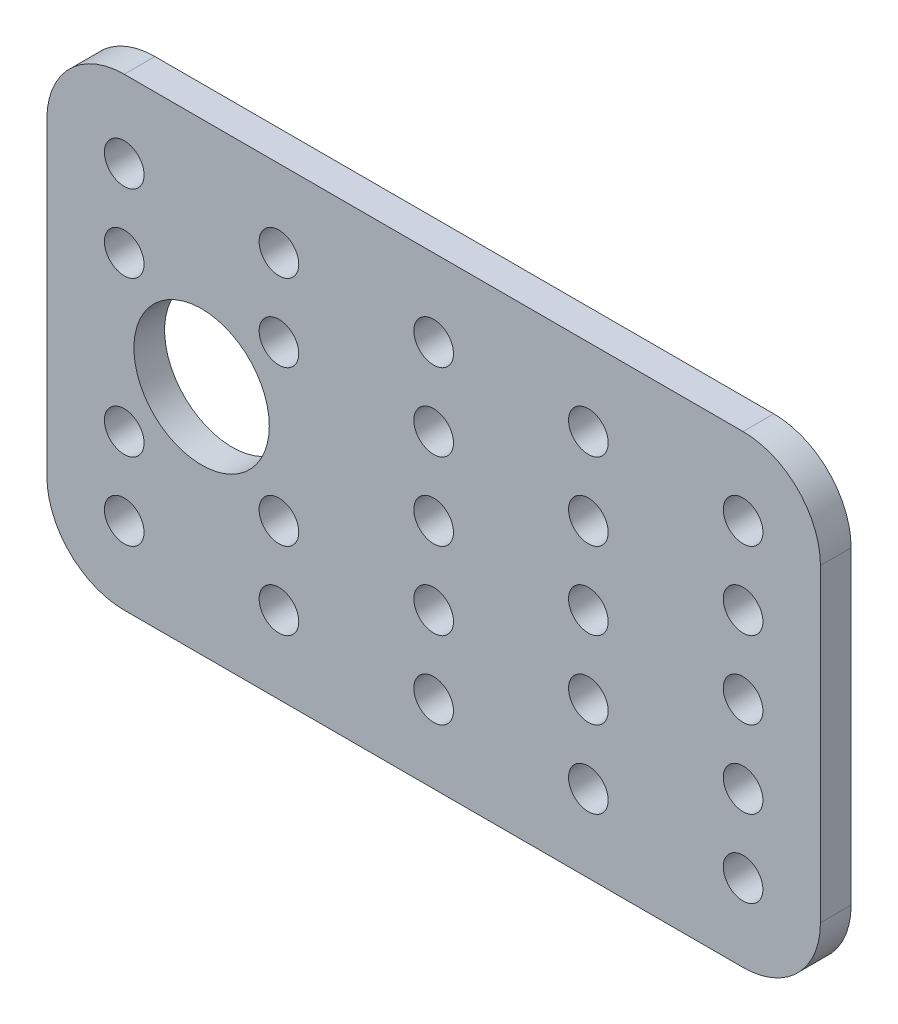
ISO-10303-21;
HEADER;
FILE_DESCRIPTION(('STEP AP214'),'2;1');
FILE_NAME('part.step','',(''),(''),'','','');
FILE_SCHEMA(('AUTOMOTIVE_DESIGN { 1 0 10303 214 1 1 1 1 }'));
ENDSEC;
DATA;
#1=APPLICATION_CONTEXT('core data for automotive mechanical design processes');
#2=APPLICATION_PROTOCOL_DEFINITION('international standard','automotive_design',2000,#1);
#3=PRODUCT_CONTEXT('',#1,'mechanical');
#4=PRODUCT('Part','Part','',(#3));
#5=PRODUCT_RELATED_PRODUCT_CATEGORY('part','',(#4));
#6=PRODUCT_DEFINITION_FORMATION('','',#4);
#7=PRODUCT_DEFINITION_CONTEXT('part definition',#1,'design');
#8=PRODUCT_DEFINITION('design','',#6,#7);
#9=PRODUCT_DEFINITION_SHAPE('','',#8);
#10=(LENGTH_UNIT() NAMED_UNIT(*) SI_UNIT(.MILLI.,.METRE.));
#11=(NAMED_UNIT(*) PLANE_ANGLE_UNIT() SI_UNIT($,.RADIAN.));
#12=(NAMED_UNIT(*) SI_UNIT($,.STERADIAN.) SOLID_ANGLE_UNIT());
#13=UNCERTAINTY_MEASURE_WITH_UNIT(LENGTH_MEASURE(1.E-05),#10,'distance_accuracy_value','');
#14=(GEOMETRIC_REPRESENTATION_CONTEXT(3) GLOBAL_UNCERTAINTY_ASSIGNED_CONTEXT((#13)) GLOBAL_UNIT_ASSIGNED_CONTEXT((#10,
#11,#12)) REPRESENTATION_CONTEXT('',''));
#15=CARTESIAN_POINT('',(0.,0.,0.));
#16=DIRECTION('',(0.,0.,1.));
#17=DIRECTION('',(1.,0.,0.));
#18=AXIS2_PLACEMENT_3D('',#15,#16,#17);
#19=CARTESIAN_POINT('',(0.,0.,3.175));
#20=DIRECTION('',(0.,0.,1.));
#21=DIRECTION('',(1.,0.,0.));
#22=AXIS2_PLACEMENT_3D('',#19,#20,#21);
#23=PLANE('',#22);
#24=CARTESIAN_POINT('',(-31.9999999999998,-8.00000000000001,3.175));
#25=DIRECTION('',(0.,0.,1.));
#26=DIRECTION('',(1.,0.,0.));
#27=AXIS2_PLACEMENT_3D('',#24,#25,#26);
#28=CIRCLE('',#27,2.05);
#29=CARTESIAN_POINT('',(-29.9499999999998,-8.00000000000001,3.175));
#30=VERTEX_POINT('',#29);
#31=EDGE_CURVE('E303',#30,#30,#28,.T.);
#32=ORIENTED_EDGE('',*,*,#31,.F.);
#33=EDGE_LOOP('',(#32));
#34=FACE_BOUND('',#33,.T.);
#35=CARTESIAN_POINT('',(32.0000000000003,-16.,3.175));
#36=DIRECTION('',(0.,0.,1.));
#37=DIRECTION('',(1.,0.,0.));
#38=AXIS2_PLACEMENT_3D('',#35,#36,#37);
#39=CIRCLE('',#38,2.04999999999999);
#40=CARTESIAN_POINT('',(34.0500000000003,-16.,3.175));
#41=VERTEX_POINT('',#40);
#42=EDGE_CURVE('E291',#41,#41,#39,.T.);
#43=ORIENTED_EDGE('',*,*,#42,.F.);
#44=EDGE_LOOP('',(#43));
#45=FACE_BOUND('',#44,.T.);
#46=CARTESIAN_POINT('',(3.33066907387547E-13,-16.,3.175));
#47=DIRECTION('',(0.,0.,1.));
#48=DIRECTION('',(1.,0.,0.));
#49=AXIS2_PLACEMENT_3D('',#46,#47,#48);
#50=CIRCLE('',#49,2.04999999999999);
#51=CARTESIAN_POINT('',(2.05000000000033,-16.,3.175));
#52=VERTEX_POINT('',#51);
#53=EDGE_CURVE('E279',#52,#52,#50,.T.);
#54=ORIENTED_EDGE('',*,*,#53,.F.);
#55=EDGE_LOOP('',(#54));
#56=FACE_BOUND('',#55,.T.);
#57=CARTESIAN_POINT('',(32.0000000000002,-8.00000000000001,3.175));
#58=DIRECTION('',(0.,0.,1.));
#59=DIRECTION('',(1.,0.,0.));
#60=AXIS2_PLACEMENT_3D('',#57,#58,#59);
#61=CIRCLE('',#60,2.04999999999999);
#62=CARTESIAN_POINT('',(34.0500000000002,-8.00000000000001,3.175));
#63=VERTEX_POINT('',#62);
#64=EDGE_CURVE('E267',#63,#63,#61,.T.);
#65=ORIENTED_EDGE('',*,*,#64,.F.);
#66=EDGE_LOOP('',(#65));
#67=FACE_BOUND('',#66,.T.);
#68=CARTESIAN_POINT('',(2.4980018054066E-13,-8.00000000000001,3.175));
#69=DIRECTION('',(0.,0.,1.));
#70=DIRECTION('',(1.,0.,0.));
#71=AXIS2_PLACEMENT_3D('',#68,#69,#70);
#72=CIRCLE('',#71,2.04999999999999);
#73=CARTESIAN_POINT('',(2.05000000000024,-8.00000000000001,3.175));
#74=VERTEX_POINT('',#73);
#75=EDGE_CURVE('E255',#74,#74,#72,.T.);
#76=ORIENTED_EDGE('',*,*,#75,.F.);
#77=EDGE_LOOP('',(#76));
#78=FACE_BOUND('',#77,.T.);
#79=CARTESIAN_POINT('',(32.0000000000002,0.,3.175));
#80=DIRECTION('',(0.,0.,1.));
#81=DIRECTION('',(1.,0.,0.));
#82=AXIS2_PLACEMENT_3D('',#79,#80,#81);
#83=CIRCLE('',#82,2.04999999999999);
#84=CARTESIAN_POINT('',(34.0500000000002,0.,3.175));
#85=VERTEX_POINT('',#84);
#86=EDGE_CURVE('E243',#85,#85,#83,.T.);
#87=ORIENTED_EDGE('',*,*,#86,.F.);
#88=EDGE_LOOP('',(#87));
#89=FACE_BOUND('',#88,.T.);
#90=CARTESIAN_POINT('',(1.66533453693773E-13,0.,3.175));
#91=DIRECTION('',(0.,0.,1.));
#92=DIRECTION('',(1.,0.,0.));
#93=AXIS2_PLACEMENT_3D('',#90,#91,#92);
#94=CIRCLE('',#93,2.04999999999999);
#95=CARTESIAN_POINT('',(2.05000000000016,0.,3.175));
#96=VERTEX_POINT('',#95);
#97=EDGE_CURVE('E231',#96,#96,#94,.T.);
#98=ORIENTED_EDGE('',*,*,#97,.F.);
#99=EDGE_LOOP('',(#98));
#100=FACE_BOUND('',#99,.T.);
#101=CARTESIAN_POINT('',(16.0000000000001,7.99999999999999,3.175));
#102=DIRECTION('',(0.,0.,1.));
#103=DIRECTION('',(1.,0.,0.));
#104=AXIS2_PLACEMENT_3D('',#101,#102,#103);
#105=CIRCLE('',#104,2.04999999999999);
#106=CARTESIAN_POINT('',(18.0500000000001,7.99999999999999,3.175));
#107=VERTEX_POINT('',#106);
#108=EDGE_CURVE('E219',#107,#107,#105,.T.);
#109=ORIENTED_EDGE('',*,*,#108,.F.);
#110=EDGE_LOOP('',(#109));
#111=FACE_BOUND('',#110,.T.);
#112=CARTESIAN_POINT('',(-15.9999999999999,7.99999999999999,3.175));
#113=DIRECTION('',(0.,0.,1.));
#114=DIRECTION('',(1.,0.,0.));
#115=AXIS2_PLACEMENT_3D('',#112,#113,#114);
#116=CIRCLE('',#115,2.05);
#117=CARTESIAN_POINT('',(-13.9499999999999,7.99999999999999,3.175));
#118=VERTEX_POINT('',#117);
#119=EDGE_CURVE('E207',#118,#118,#116,.T.);
#120=ORIENTED_EDGE('',*,*,#119,.F.);
#121=EDGE_LOOP('',(#120));
#122=FACE_BOUND('',#121,.T.);
#123=CARTESIAN_POINT('',(16.,16.,3.175));
#124=DIRECTION('',(0.,0.,1.));
#125=DIRECTION('',(1.,0.,0.));
#126=AXIS2_PLACEMENT_3D('',#123,#124,#125);
#127=CIRCLE('',#126,2.05);
#128=CARTESIAN_POINT('',(18.05,16.,3.175));
#129=VERTEX_POINT('',#128);
#130=EDGE_CURVE('E195',#129,#129,#127,.T.);
#131=ORIENTED_EDGE('',*,*,#130,.F.);
#132=EDGE_LOOP('',(#131));
#133=FACE_BOUND('',#132,.T.);
#134=CARTESIAN_POINT('',(-16.,16.,3.175));
#135=DIRECTION('',(0.,0.,1.));
#136=DIRECTION('',(1.,0.,0.));
#137=AXIS2_PLACEMENT_3D('',#134,#135,#136);
#138=CIRCLE('',#137,2.05);
#139=CARTESIAN_POINT('',(-13.95,16.,3.175));
#140=VERTEX_POINT('',#139);
#141=EDGE_CURVE('E183',#140,#140,#138,.T.);
#142=ORIENTED_EDGE('',*,*,#141,.F.);
#143=EDGE_LOOP('',(#142));
#144=FACE_BOUND('',#143,.T.);
#145=CARTESIAN_POINT('',(-24.,0.,3.175));
#146=DIRECTION('',(0.,0.,1.));
#147=DIRECTION('',(1.,0.,0.));
#148=AXIS2_PLACEMENT_3D('',#145,#146,#147);
#149=CIRCLE('',#148,7.);
#150=CARTESIAN_POINT('',(-17.,0.,3.175));
#151=VERTEX_POINT('',#150);
#152=EDGE_CURVE('E166',#151,#151,#149,.T.);
#153=ORIENTED_EDGE('',*,*,#152,.F.);
#154=EDGE_LOOP('',(#153));
#155=FACE_BOUND('',#154,.T.);
#156=DIRECTION('',(0.,1.,0.));
#157=VECTOR('',#156,1.);
#158=CARTESIAN_POINT('',(40.,-24.,3.175));
#159=LINE('',#158,#157);
#160=CARTESIAN_POINT('',(40.,-16.,3.175));
#161=VERTEX_POINT('',#160);
#162=CARTESIAN_POINT('',(40.,16.,3.175));
#163=VERTEX_POINT('',#162);
#164=EDGE_CURVE('E173',#161,#163,#159,.T.);
#165=ORIENTED_EDGE('',*,*,#164,.T.);
#166=CARTESIAN_POINT('',(32.,16.,3.175));
#167=DIRECTION('',(0.,0.,1.));
#168=DIRECTION('',(1.,0.,0.));
#169=AXIS2_PLACEMENT_3D('',#166,#167,#168);
#170=CIRCLE('',#169,8.);
#171=CARTESIAN_POINT('',(32.,24.,3.175));
#172=VERTEX_POINT('',#171);
#173=EDGE_CURVE('E150',#163,#172,#170,.T.);
#174=ORIENTED_EDGE('',*,*,#173,.T.);
#175=DIRECTION('',(-1.,0.,0.));
#176=VECTOR('',#175,1.);
#177=CARTESIAN_POINT('',(40.,24.,3.175));
#178=LINE('',#177,#176);
#179=CARTESIAN_POINT('',(-32.,24.,3.175));
#180=VERTEX_POINT('',#179);
#181=EDGE_CURVE('E121',#172,#180,#178,.T.);
#182=ORIENTED_EDGE('',*,*,#181,.T.);
#183=CARTESIAN_POINT('',(-32.,16.,3.175));
#184=DIRECTION('',(0.,0.,1.));
#185=DIRECTION('',(1.,0.,0.));
#186=AXIS2_PLACEMENT_3D('',#183,#184,#185);
#187=CIRCLE('',#186,8.);
#188=CARTESIAN_POINT('',(-40.,16.,3.175));
#189=VERTEX_POINT('',#188);
#190=EDGE_CURVE('E145',#180,#189,#187,.T.);
#191=ORIENTED_EDGE('',*,*,#190,.T.);
#192=DIRECTION('',(0.,-1.,0.));
#193=VECTOR('',#192,1.);
#194=CARTESIAN_POINT('',(-40.,-24.,3.175));
#195=LINE('',#194,#193);
#196=CARTESIAN_POINT('',(-40.,-16.,3.175));
#197=VERTEX_POINT('',#196);
#198=EDGE_CURVE('E128',#189,#197,#195,.T.);
#199=ORIENTED_EDGE('',*,*,#198,.T.);
#200=CARTESIAN_POINT('',(-32.,-16.,3.175));
#201=DIRECTION('',(0.,0.,1.));
#202=DIRECTION('',(1.,0.,0.));
#203=AXIS2_PLACEMENT_3D('',#200,#201,#202);
#204=CIRCLE('',#203,8.);
#205=CARTESIAN_POINT('',(-32.,-24.,3.175));
#206=VERTEX_POINT('',#205);
#207=EDGE_CURVE('E57',#197,#206,#204,.T.);
#208=ORIENTED_EDGE('',*,*,#207,.T.);
#209=DIRECTION('',(1.,0.,0.));
#210=VECTOR('',#209,1.);
#211=CARTESIAN_POINT('',(40.,-24.,3.175));
#212=LINE('',#211,#210);
#213=CARTESIAN_POINT('',(32.,-24.,3.175));
#214=VERTEX_POINT('',#213);
#215=EDGE_CURVE('E131',#206,#214,#212,.T.);
#216=ORIENTED_EDGE('',*,*,#215,.T.);
#217=CARTESIAN_POINT('',(32.,-16.,3.175));
#218=DIRECTION('',(0.,0.,1.));
#219=DIRECTION('',(1.,0.,0.));
#220=AXIS2_PLACEMENT_3D('',#217,#218,#219);
#221=CIRCLE('',#220,8.);
#222=EDGE_CURVE('E148',#214,#161,#221,.T.);
#223=ORIENTED_EDGE('',*,*,#222,.T.);
#224=EDGE_LOOP('',(#165,#174,#182,#191,#199,#208,#216,#223));
#225=FACE_BOUND('',#224,.T.);
#226=CARTESIAN_POINT('',(-32.,16.,3.175));
#227=DIRECTION('',(0.,0.,1.));
#228=DIRECTION('',(1.,0.,0.));
#229=AXIS2_PLACEMENT_3D('',#226,#227,#228);
#230=CIRCLE('',#229,2.05);
#231=CARTESIAN_POINT('',(-29.95,16.,3.175));
#232=VERTEX_POINT('',#231);
#233=EDGE_CURVE('E178',#232,#232,#230,.T.);
#234=ORIENTED_EDGE('',*,*,#233,.F.);
#235=EDGE_LOOP('',(#234));
#236=FACE_BOUND('',#235,.T.);
#237=CARTESIAN_POINT('',(0.,16.,3.175));
#238=DIRECTION('',(0.,0.,1.));
#239=DIRECTION('',(1.,0.,0.));
#240=AXIS2_PLACEMENT_3D('',#237,#238,#239);
#241=CIRCLE('',#240,2.04999999999999);
#242=CARTESIAN_POINT('',(2.04999999999999,16.,3.175));
#243=VERTEX_POINT('',#242);
#244=EDGE_CURVE('E189',#243,#243,#241,.T.);
#245=ORIENTED_EDGE('',*,*,#244,.F.);
#246=EDGE_LOOP('',(#245));
#247=FACE_BOUND('',#246,.T.);
#248=CARTESIAN_POINT('',(32.,16.,3.175));
#249=DIRECTION('',(0.,0.,1.));
#250=DIRECTION('',(1.,0.,0.));
#251=AXIS2_PLACEMENT_3D('',#248,#249,#250);
#252=CIRCLE('',#251,2.04999999999999);
#253=CARTESIAN_POINT('',(34.05,16.,3.175));
#254=VERTEX_POINT('',#253);
#255=EDGE_CURVE('E201',#254,#254,#252,.T.);
#256=ORIENTED_EDGE('',*,*,#255,.F.);
#257=EDGE_LOOP('',(#256));
#258=FACE_BOUND('',#257,.T.);
#259=CARTESIAN_POINT('',(0.,7.99999999999999,3.175));
#260=DIRECTION('',(0.,0.,1.));
#261=DIRECTION('',(1.,0.,0.));
#262=AXIS2_PLACEMENT_3D('',#259,#260,#261);
#263=CIRCLE('',#262,2.04999999999999);
#264=CARTESIAN_POINT('',(2.05000000000008,7.99999999999999,3.175));
#265=VERTEX_POINT('',#264);
#266=EDGE_CURVE('E213',#265,#265,#263,.T.);
#267=ORIENTED_EDGE('',*,*,#266,.F.);
#268=EDGE_LOOP('',(#267));
#269=FACE_BOUND('',#268,.T.);
#270=CARTESIAN_POINT('',(32.0000000000001,7.99999999999999,3.175));
#271=DIRECTION('',(0.,0.,1.));
#272=DIRECTION('',(1.,0.,0.));
#273=AXIS2_PLACEMENT_3D('',#270,#271,#272);
#274=CIRCLE('',#273,2.04999999999999);
#275=CARTESIAN_POINT('',(34.0500000000001,7.99999999999999,3.175));
#276=VERTEX_POINT('',#275);
#277=EDGE_CURVE('E225',#276,#276,#274,.T.);
#278=ORIENTED_EDGE('',*,*,#277,.F.);
#279=EDGE_LOOP('',(#278));
#280=FACE_BOUND('',#279,.T.);
#281=CARTESIAN_POINT('',(16.0000000000002,0.,3.175));
#282=DIRECTION('',(0.,0.,1.));
#283=DIRECTION('',(1.,0.,0.));
#284=AXIS2_PLACEMENT_3D('',#281,#282,#283);
#285=CIRCLE('',#284,2.04999999999999);
#286=CARTESIAN_POINT('',(18.0500000000002,0.,3.175));
#287=VERTEX_POINT('',#286);
#288=EDGE_CURVE('E237',#287,#287,#285,.T.);
#289=ORIENTED_EDGE('',*,*,#288,.F.);
#290=EDGE_LOOP('',(#289));
#291=FACE_BOUND('',#290,.T.);
#292=CARTESIAN_POINT('',(-15.9999999999998,-8.00000000000001,3.175));
#293=DIRECTION('',(0.,0.,1.));
#294=DIRECTION('',(1.,0.,0.));
#295=AXIS2_PLACEMENT_3D('',#292,#293,#294);
#296=CIRCLE('',#295,2.04999999999999);
#297=CARTESIAN_POINT('',(-13.9499999999998,-8.00000000000001,3.175));
#298=VERTEX_POINT('',#297);
#299=EDGE_CURVE('E249',#298,#298,#296,.T.);
#300=ORIENTED_EDGE('',*,*,#299,.F.);
#301=EDGE_LOOP('',(#300));
#302=FACE_BOUND('',#301,.T.);
#303=CARTESIAN_POINT('',(16.0000000000002,-8.00000000000001,3.175));
#304=DIRECTION('',(0.,0.,1.));
#305=DIRECTION('',(1.,0.,0.));
#306=AXIS2_PLACEMENT_3D('',#303,#304,#305);
#307=CIRCLE('',#306,2.04999999999999);
#308=CARTESIAN_POINT('',(18.0500000000002,-8.00000000000001,3.175));
#309=VERTEX_POINT('',#308);
#310=EDGE_CURVE('E261',#309,#309,#307,.T.);
#311=ORIENTED_EDGE('',*,*,#310,.F.);
#312=EDGE_LOOP('',(#311));
#313=FACE_BOUND('',#312,.T.);
#314=CARTESIAN_POINT('',(-15.9999999999997,-16.,3.175));
#315=DIRECTION('',(0.,0.,1.));
#316=DIRECTION('',(1.,0.,0.));
#317=AXIS2_PLACEMENT_3D('',#314,#315,#316);
#318=CIRCLE('',#317,2.05);
#319=CARTESIAN_POINT('',(-13.9499999999997,-16.,3.175));
#320=VERTEX_POINT('',#319);
#321=EDGE_CURVE('E273',#320,#320,#318,.T.);
#322=ORIENTED_EDGE('',*,*,#321,.F.);
#323=EDGE_LOOP('',(#322));
#324=FACE_BOUND('',#323,.T.);
#325=CARTESIAN_POINT('',(16.0000000000003,-16.,3.175));
#326=DIRECTION('',(0.,0.,1.));
#327=DIRECTION('',(1.,0.,0.));
#328=AXIS2_PLACEMENT_3D('',#325,#326,#327);
#329=CIRCLE('',#328,2.04999999999999);
#330=CARTESIAN_POINT('',(18.0500000000003,-16.,3.175));
#331=VERTEX_POINT('',#330);
#332=EDGE_CURVE('E285',#331,#331,#329,.T.);
#333=ORIENTED_EDGE('',*,*,#332,.F.);
#334=EDGE_LOOP('',(#333));
#335=FACE_BOUND('',#334,.T.);
#336=CARTESIAN_POINT('',(-31.9999999999999,7.99999999999999,3.175));
#337=DIRECTION('',(0.,0.,1.));
#338=DIRECTION('',(1.,0.,0.));
#339=AXIS2_PLACEMENT_3D('',#336,#337,#338);
#340=CIRCLE('',#339,2.05);
#341=CARTESIAN_POINT('',(-29.9499999999999,7.99999999999999,3.175));
#342=VERTEX_POINT('',#341);
#343=EDGE_CURVE('E297',#342,#342,#340,.T.);
#344=ORIENTED_EDGE('',*,*,#343,.F.);
#345=EDGE_LOOP('',(#344));
#346=FACE_BOUND('',#345,.T.);
#347=CARTESIAN_POINT('',(-31.9999999999997,-16.,3.175));
#348=DIRECTION('',(0.,0.,1.));
#349=DIRECTION('',(1.,0.,0.));
#350=AXIS2_PLACEMENT_3D('',#347,#348,#349);
#351=CIRCLE('',#350,2.05);
#352=CARTESIAN_POINT('',(-29.9499999999997,-16.,3.175));
#353=VERTEX_POINT('',#352);
#354=EDGE_CURVE('E309',#353,#353,#351,.T.);
#355=ORIENTED_EDGE('',*,*,#354,.F.);
#356=EDGE_LOOP('',(#355));
#357=FACE_BOUND('',#356,.T.);
#358=ADVANCED_FACE('F35',(#34,#45,#56,#67,#78,#89,#100,#111,#122,#133,#144,#155,#225,#236,#247,
#258,#269,#280,#291,#302,#313,#324,#335,#346,#357),#23,.T.);
#359=CARTESIAN_POINT('',(0.,0.,0.));
#360=DIRECTION('',(0.,0.,1.));
#361=DIRECTION('',(1.,0.,0.));
#362=AXIS2_PLACEMENT_3D('',#359,#360,#361);
#363=PLANE('',#362);
#364=DIRECTION('',(-1.,0.,0.));
#365=VECTOR('',#364,1.);
#366=CARTESIAN_POINT('',(40.,24.,0.));
#367=LINE('',#366,#365);
#368=CARTESIAN_POINT('',(32.,24.,0.));
#369=VERTEX_POINT('',#368);
#370=CARTESIAN_POINT('',(-32.,24.,0.));
#371=VERTEX_POINT('',#370);
#372=EDGE_CURVE('E118',#369,#371,#367,.T.);
#373=ORIENTED_EDGE('',*,*,#372,.F.);
#374=CARTESIAN_POINT('',(32.,16.,0.));
#375=DIRECTION('',(0.,0.,1.));
#376=DIRECTION('',(1.,0.,0.));
#377=AXIS2_PLACEMENT_3D('',#374,#375,#376);
#378=CIRCLE('',#377,8.);
#379=CARTESIAN_POINT('',(40.,16.,0.));
#380=VERTEX_POINT('',#379);
#381=EDGE_CURVE('E101',#369,#380,#378,.F.);
#382=ORIENTED_EDGE('',*,*,#381,.T.);
#383=DIRECTION('',(0.,1.,0.));
#384=VECTOR('',#383,1.);
#385=CARTESIAN_POINT('',(40.,-24.,0.));
#386=LINE('',#385,#384);
#387=CARTESIAN_POINT('',(40.,-16.,0.));
#388=VERTEX_POINT('',#387);
#389=EDGE_CURVE('E129',#388,#380,#386,.T.);
#390=ORIENTED_EDGE('',*,*,#389,.F.);
#391=CARTESIAN_POINT('',(32.,-16.,0.));
#392=DIRECTION('',(0.,0.,1.));
#393=DIRECTION('',(1.,0.,0.));
#394=AXIS2_PLACEMENT_3D('',#391,#392,#393);
#395=CIRCLE('',#394,8.);
#396=CARTESIAN_POINT('',(32.,-24.,0.));
#397=VERTEX_POINT('',#396);
#398=EDGE_CURVE('E112',#388,#397,#395,.F.);
#399=ORIENTED_EDGE('',*,*,#398,.T.);
#400=DIRECTION('',(1.,0.,0.));
#401=VECTOR('',#400,1.);
#402=CARTESIAN_POINT('',(40.,-24.,0.));
#403=LINE('',#402,#401);
#404=CARTESIAN_POINT('',(-32.,-24.,0.));
#405=VERTEX_POINT('',#404);
#406=EDGE_CURVE('E133',#405,#397,#403,.T.);
#407=ORIENTED_EDGE('',*,*,#406,.F.);
#408=CARTESIAN_POINT('',(-32.,-16.,0.));
#409=DIRECTION('',(0.,0.,1.));
#410=DIRECTION('',(1.,0.,0.));
#411=AXIS2_PLACEMENT_3D('',#408,#409,#410);
#412=CIRCLE('',#411,8.);
#413=CARTESIAN_POINT('',(-40.,-16.,0.));
#414=VERTEX_POINT('',#413);
#415=EDGE_CURVE('E139',#405,#414,#412,.F.);
#416=ORIENTED_EDGE('',*,*,#415,.T.);
#417=DIRECTION('',(0.,-1.,0.));
#418=VECTOR('',#417,1.);
#419=CARTESIAN_POINT('',(-40.,-24.,0.));
#420=LINE('',#419,#418);
#421=CARTESIAN_POINT('',(-40.,16.,0.));
#422=VERTEX_POINT('',#421);
#423=EDGE_CURVE('E161',#422,#414,#420,.T.);
#424=ORIENTED_EDGE('',*,*,#423,.F.);
#425=CARTESIAN_POINT('',(-32.,16.,0.));
#426=DIRECTION('',(0.,0.,1.));
#427=DIRECTION('',(1.,0.,0.));
#428=AXIS2_PLACEMENT_3D('',#425,#426,#427);
#429=CIRCLE('',#428,8.);
#430=EDGE_CURVE('E122',#422,#371,#429,.F.);
#431=ORIENTED_EDGE('',*,*,#430,.T.);
#432=EDGE_LOOP('',(#373,#382,#390,#399,#407,#416,#424,#431));
#433=FACE_BOUND('',#432,.T.);
#434=CARTESIAN_POINT('',(-24.,0.,0.));
#435=DIRECTION('',(0.,0.,1.));
#436=DIRECTION('',(1.,0.,0.));
#437=AXIS2_PLACEMENT_3D('',#434,#435,#436);
#438=CIRCLE('',#437,7.);
#439=CARTESIAN_POINT('',(-17.,0.,0.));
#440=VERTEX_POINT('',#439);
#441=EDGE_CURVE('E169',#440,#440,#438,.T.);
#442=ORIENTED_EDGE('',*,*,#441,.T.);
#443=EDGE_LOOP('',(#442));
#444=FACE_BOUND('',#443,.T.);
#445=CARTESIAN_POINT('',(-32.,16.,0.));
#446=DIRECTION('',(0.,0.,1.));
#447=DIRECTION('',(1.,0.,0.));
#448=AXIS2_PLACEMENT_3D('',#445,#446,#447);
#449=CIRCLE('',#448,2.05);
#450=CARTESIAN_POINT('',(-29.95,16.,0.));
#451=VERTEX_POINT('',#450);
#452=EDGE_CURVE('E180',#451,#451,#449,.T.);
#453=ORIENTED_EDGE('',*,*,#452,.T.);
#454=EDGE_LOOP('',(#453));
#455=FACE_BOUND('',#454,.T.);
#456=CARTESIAN_POINT('',(-16.,16.,0.));
#457=DIRECTION('',(0.,0.,1.));
#458=DIRECTION('',(1.,0.,0.));
#459=AXIS2_PLACEMENT_3D('',#456,#457,#458);
#460=CIRCLE('',#459,2.05);
#461=CARTESIAN_POINT('',(-13.95,16.,0.));
#462=VERTEX_POINT('',#461);
#463=EDGE_CURVE('E186',#462,#462,#460,.T.);
#464=ORIENTED_EDGE('',*,*,#463,.T.);
#465=EDGE_LOOP('',(#464));
#466=FACE_BOUND('',#465,.T.);
#467=CARTESIAN_POINT('',(0.,16.,0.));
#468=DIRECTION('',(0.,0.,1.));
#469=DIRECTION('',(1.,0.,0.));
#470=AXIS2_PLACEMENT_3D('',#467,#468,#469);
#471=CIRCLE('',#470,2.04999999999999);
#472=CARTESIAN_POINT('',(2.04999999999999,16.,0.));
#473=VERTEX_POINT('',#472);
#474=EDGE_CURVE('E192',#473,#473,#471,.T.);
#475=ORIENTED_EDGE('',*,*,#474,.T.);
#476=EDGE_LOOP('',(#475));
#477=FACE_BOUND('',#476,.T.);
#478=CARTESIAN_POINT('',(16.,16.,0.));
#479=DIRECTION('',(0.,0.,1.));
#480=DIRECTION('',(1.,0.,0.));
#481=AXIS2_PLACEMENT_3D('',#478,#479,#480);
#482=CIRCLE('',#481,2.05);
#483=CARTESIAN_POINT('',(18.05,16.,0.));
#484=VERTEX_POINT('',#483);
#485=EDGE_CURVE('E198',#484,#484,#482,.T.);
#486=ORIENTED_EDGE('',*,*,#485,.T.);
#487=EDGE_LOOP('',(#486));
#488=FACE_BOUND('',#487,.T.);
#489=CARTESIAN_POINT('',(32.,16.,0.));
#490=DIRECTION('',(0.,0.,1.));
#491=DIRECTION('',(1.,0.,0.));
#492=AXIS2_PLACEMENT_3D('',#489,#490,#491);
#493=CIRCLE('',#492,2.04999999999999);
#494=CARTESIAN_POINT('',(34.05,16.,0.));
#495=VERTEX_POINT('',#494);
#496=EDGE_CURVE('E204',#495,#495,#493,.T.);
#497=ORIENTED_EDGE('',*,*,#496,.T.);
#498=EDGE_LOOP('',(#497));
#499=FACE_BOUND('',#498,.T.);
#500=CARTESIAN_POINT('',(-15.9999999999999,7.99999999999999,0.));
#501=DIRECTION('',(0.,0.,1.));
#502=DIRECTION('',(1.,0.,0.));
#503=AXIS2_PLACEMENT_3D('',#500,#501,#502);
#504=CIRCLE('',#503,2.05);
#505=CARTESIAN_POINT('',(-13.9499999999999,7.99999999999999,0.));
#506=VERTEX_POINT('',#505);
#507=EDGE_CURVE('E210',#506,#506,#504,.T.);
#508=ORIENTED_EDGE('',*,*,#507,.T.);
#509=EDGE_LOOP('',(#508));
#510=FACE_BOUND('',#509,.T.);
#511=CARTESIAN_POINT('',(0.,7.99999999999999,0.));
#512=DIRECTION('',(0.,0.,1.));
#513=DIRECTION('',(1.,0.,0.));
#514=AXIS2_PLACEMENT_3D('',#511,#512,#513);
#515=CIRCLE('',#514,2.04999999999999);
#516=CARTESIAN_POINT('',(2.05000000000008,7.99999999999999,0.));
#517=VERTEX_POINT('',#516);
#518=EDGE_CURVE('E216',#517,#517,#515,.T.);
#519=ORIENTED_EDGE('',*,*,#518,.T.);
#520=EDGE_LOOP('',(#519));
#521=FACE_BOUND('',#520,.T.);
#522=CARTESIAN_POINT('',(16.0000000000001,7.99999999999999,0.));
#523=DIRECTION('',(0.,0.,1.));
#524=DIRECTION('',(1.,0.,0.));
#525=AXIS2_PLACEMENT_3D('',#522,#523,#524);
#526=CIRCLE('',#525,2.04999999999999);
#527=CARTESIAN_POINT('',(18.0500000000001,7.99999999999999,0.));
#528=VERTEX_POINT('',#527);
#529=EDGE_CURVE('E222',#528,#528,#526,.T.);
#530=ORIENTED_EDGE('',*,*,#529,.T.);
#531=EDGE_LOOP('',(#530));
#532=FACE_BOUND('',#531,.T.);
#533=CARTESIAN_POINT('',(32.0000000000001,7.99999999999999,0.));
#534=DIRECTION('',(0.,0.,1.));
#535=DIRECTION('',(1.,0.,0.));
#536=AXIS2_PLACEMENT_3D('',#533,#534,#535);
#537=CIRCLE('',#536,2.04999999999999);
#538=CARTESIAN_POINT('',(34.0500000000001,7.99999999999999,0.));
#539=VERTEX_POINT('',#538);
#540=EDGE_CURVE('E228',#539,#539,#537,.T.);
#541=ORIENTED_EDGE('',*,*,#540,.T.);
#542=EDGE_LOOP('',(#541));
#543=FACE_BOUND('',#542,.T.);
#544=CARTESIAN_POINT('',(1.66533453693773E-13,0.,0.));
#545=DIRECTION('',(0.,0.,1.));
#546=DIRECTION('',(1.,0.,0.));
#547=AXIS2_PLACEMENT_3D('',#544,#545,#546);
#548=CIRCLE('',#547,2.04999999999999);
#549=CARTESIAN_POINT('',(2.05000000000016,0.,0.));
#550=VERTEX_POINT('',#549);
#551=EDGE_CURVE('E234',#550,#550,#548,.T.);
#552=ORIENTED_EDGE('',*,*,#551,.T.);
#553=EDGE_LOOP('',(#552));
#554=FACE_BOUND('',#553,.T.);
#555=CARTESIAN_POINT('',(16.0000000000002,0.,0.));
#556=DIRECTION('',(0.,0.,1.));
#557=DIRECTION('',(1.,0.,0.));
#558=AXIS2_PLACEMENT_3D('',#555,#556,#557);
#559=CIRCLE('',#558,2.04999999999999);
#560=CARTESIAN_POINT('',(18.0500000000002,0.,0.));
#561=VERTEX_POINT('',#560);
#562=EDGE_CURVE('E240',#561,#561,#559,.T.);
#563=ORIENTED_EDGE('',*,*,#562,.T.);
#564=EDGE_LOOP('',(#563));
#565=FACE_BOUND('',#564,.T.);
#566=CARTESIAN_POINT('',(32.0000000000002,0.,0.));
#567=DIRECTION('',(0.,0.,1.));
#568=DIRECTION('',(1.,0.,0.));
#569=AXIS2_PLACEMENT_3D('',#566,#567,#568);
#570=CIRCLE('',#569,2.04999999999999);
#571=CARTESIAN_POINT('',(34.0500000000002,0.,0.));
#572=VERTEX_POINT('',#571);
#573=EDGE_CURVE('E246',#572,#572,#570,.T.);
#574=ORIENTED_EDGE('',*,*,#573,.T.);
#575=EDGE_LOOP('',(#574));
#576=FACE_BOUND('',#575,.T.);
#577=CARTESIAN_POINT('',(-15.9999999999998,-8.00000000000001,0.));
#578=DIRECTION('',(0.,0.,1.));
#579=DIRECTION('',(1.,0.,0.));
#580=AXIS2_PLACEMENT_3D('',#577,#578,#579);
#581=CIRCLE('',#580,2.04999999999999);
#582=CARTESIAN_POINT('',(-13.9499999999998,-8.00000000000001,0.));
#583=VERTEX_POINT('',#582);
#584=EDGE_CURVE('E252',#583,#583,#581,.T.);
#585=ORIENTED_EDGE('',*,*,#584,.T.);
#586=EDGE_LOOP('',(#585));
#587=FACE_BOUND('',#586,.T.);
#588=CARTESIAN_POINT('',(2.4980018054066E-13,-8.00000000000001,0.));
#589=DIRECTION('',(0.,0.,1.));
#590=DIRECTION('',(1.,0.,0.));
#591=AXIS2_PLACEMENT_3D('',#588,#589,#590);
#592=CIRCLE('',#591,2.04999999999999);
#593=CARTESIAN_POINT('',(2.05000000000024,-8.00000000000001,0.));
#594=VERTEX_POINT('',#593);
#595=EDGE_CURVE('E258',#594,#594,#592,.T.);
#596=ORIENTED_EDGE('',*,*,#595,.T.);
#597=EDGE_LOOP('',(#596));
#598=FACE_BOUND('',#597,.T.);
#599=CARTESIAN_POINT('',(16.0000000000002,-8.00000000000001,0.));
#600=DIRECTION('',(0.,0.,1.));
#601=DIRECTION('',(1.,0.,0.));
#602=AXIS2_PLACEMENT_3D('',#599,#600,#601);
#603=CIRCLE('',#602,2.04999999999999);
#604=CARTESIAN_POINT('',(18.0500000000002,-8.00000000000001,0.));
#605=VERTEX_POINT('',#604);
#606=EDGE_CURVE('E264',#605,#605,#603,.T.);
#607=ORIENTED_EDGE('',*,*,#606,.T.);
#608=EDGE_LOOP('',(#607));
#609=FACE_BOUND('',#608,.T.);
#610=CARTESIAN_POINT('',(32.0000000000002,-8.00000000000001,0.));
#611=DIRECTION('',(0.,0.,1.));
#612=DIRECTION('',(1.,0.,0.));
#613=AXIS2_PLACEMENT_3D('',#610,#611,#612);
#614=CIRCLE('',#613,2.04999999999999);
#615=CARTESIAN_POINT('',(34.0500000000002,-8.00000000000001,0.));
#616=VERTEX_POINT('',#615);
#617=EDGE_CURVE('E270',#616,#616,#614,.T.);
#618=ORIENTED_EDGE('',*,*,#617,.T.);
#619=EDGE_LOOP('',(#618));
#620=FACE_BOUND('',#619,.T.);
#621=CARTESIAN_POINT('',(-15.9999999999997,-16.,0.));
#622=DIRECTION('',(0.,0.,1.));
#623=DIRECTION('',(1.,0.,0.));
#624=AXIS2_PLACEMENT_3D('',#621,#622,#623);
#625=CIRCLE('',#624,2.05);
#626=CARTESIAN_POINT('',(-13.9499999999997,-16.,0.));
#627=VERTEX_POINT('',#626);
#628=EDGE_CURVE('E276',#627,#627,#625,.T.);
#629=ORIENTED_EDGE('',*,*,#628,.T.);
#630=EDGE_LOOP('',(#629));
#631=FACE_BOUND('',#630,.T.);
#632=CARTESIAN_POINT('',(3.33066907387547E-13,-16.,0.));
#633=DIRECTION('',(0.,0.,1.));
#634=DIRECTION('',(1.,0.,0.));
#635=AXIS2_PLACEMENT_3D('',#632,#633,#634);
#636=CIRCLE('',#635,2.04999999999999);
#637=CARTESIAN_POINT('',(2.05000000000033,-16.,0.));
#638=VERTEX_POINT('',#637);
#639=EDGE_CURVE('E282',#638,#638,#636,.T.);
#640=ORIENTED_EDGE('',*,*,#639,.T.);
#641=EDGE_LOOP('',(#640));
#642=FACE_BOUND('',#641,.T.);
#643=CARTESIAN_POINT('',(16.0000000000003,-16.,0.));
#644=DIRECTION('',(0.,0.,1.));
#645=DIRECTION('',(1.,0.,0.));
#646=AXIS2_PLACEMENT_3D('',#643,#644,#645);
#647=CIRCLE('',#646,2.04999999999999);
#648=CARTESIAN_POINT('',(18.0500000000003,-16.,0.));
#649=VERTEX_POINT('',#648);
#650=EDGE_CURVE('E288',#649,#649,#647,.T.);
#651=ORIENTED_EDGE('',*,*,#650,.T.);
#652=EDGE_LOOP('',(#651));
#653=FACE_BOUND('',#652,.T.);
#654=CARTESIAN_POINT('',(32.0000000000003,-16.,0.));
#655=DIRECTION('',(0.,0.,1.));
#656=DIRECTION('',(1.,0.,0.));
#657=AXIS2_PLACEMENT_3D('',#654,#655,#656);
#658=CIRCLE('',#657,2.04999999999999);
#659=CARTESIAN_POINT('',(34.0500000000003,-16.,0.));
#660=VERTEX_POINT('',#659);
#661=EDGE_CURVE('E294',#660,#660,#658,.T.);
#662=ORIENTED_EDGE('',*,*,#661,.T.);
#663=EDGE_LOOP('',(#662));
#664=FACE_BOUND('',#663,.T.);
#665=CARTESIAN_POINT('',(-31.9999999999999,7.99999999999999,0.));
#666=DIRECTION('',(0.,0.,1.));
#667=DIRECTION('',(1.,0.,0.));
#668=AXIS2_PLACEMENT_3D('',#665,#666,#667);
#669=CIRCLE('',#668,2.05);
#670=CARTESIAN_POINT('',(-29.9499999999999,7.99999999999999,0.));
#671=VERTEX_POINT('',#670);
#672=EDGE_CURVE('E300',#671,#671,#669,.T.);
#673=ORIENTED_EDGE('',*,*,#672,.T.);
#674=EDGE_LOOP('',(#673));
#675=FACE_BOUND('',#674,.T.);
#676=CARTESIAN_POINT('',(-31.9999999999998,-8.00000000000001,0.));
#677=DIRECTION('',(0.,0.,1.));
#678=DIRECTION('',(1.,0.,0.));
#679=AXIS2_PLACEMENT_3D('',#676,#677,#678);
#680=CIRCLE('',#679,2.05);
#681=CARTESIAN_POINT('',(-29.9499999999998,-8.00000000000001,0.));
#682=VERTEX_POINT('',#681);
#683=EDGE_CURVE('E306',#682,#682,#680,.T.);
#684=ORIENTED_EDGE('',*,*,#683,.T.);
#685=EDGE_LOOP('',(#684));
#686=FACE_BOUND('',#685,.T.);
#687=CARTESIAN_POINT('',(-31.9999999999997,-16.,0.));
#688=DIRECTION('',(0.,0.,1.));
#689=DIRECTION('',(1.,0.,0.));
#690=AXIS2_PLACEMENT_3D('',#687,#688,#689);
#691=CIRCLE('',#690,2.05);
#692=CARTESIAN_POINT('',(-29.9499999999997,-16.,0.));
#693=VERTEX_POINT('',#692);
#694=EDGE_CURVE('E312',#693,#693,#691,.T.);
#695=ORIENTED_EDGE('',*,*,#694,.T.);
#696=EDGE_LOOP('',(#695));
#697=FACE_BOUND('',#696,.T.);
#698=ADVANCED_FACE('F125',(#433,#444,#455,#466,#477,#488,#499,#510,#521,#532,#543,#554,#565,
#576,#587,#598,#609,#620,#631,#642,#653,#664,#675,#686,#697),#363,.F.);
#699=CARTESIAN_POINT('',(-40.,-24.,3.175));
#700=DIRECTION('',(1.,0.,0.));
#701=DIRECTION('',(0.,1.,0.));
#702=AXIS2_PLACEMENT_3D('',#699,#700,#701);
#703=PLANE('',#702);
#704=ORIENTED_EDGE('',*,*,#423,.T.);
#705=DIRECTION('',(0.,0.,-1.));
#706=VECTOR('',#705,1.);
#707=CARTESIAN_POINT('',(-40.,-16.,3.175));
#708=LINE('',#707,#706);
#709=EDGE_CURVE('E11',#414,#197,#708,.F.);
#710=ORIENTED_EDGE('',*,*,#709,.T.);
#711=ORIENTED_EDGE('',*,*,#198,.F.);
#712=DIRECTION('',(0.,0.,-1.));
#713=VECTOR('',#712,1.);
#714=CARTESIAN_POINT('',(-40.,16.,3.175));
#715=LINE('',#714,#713);
#716=EDGE_CURVE('E43',#189,#422,#715,.T.);
#717=ORIENTED_EDGE('',*,*,#716,.T.);
#718=EDGE_LOOP('',(#704,#710,#711,#717));
#719=FACE_BOUND('',#718,.T.);
#720=ADVANCED_FACE('F160',(#719),#703,.F.);
#721=CARTESIAN_POINT('',(40.,-24.,3.175));
#722=DIRECTION('',(0.,1.,0.));
#723=DIRECTION('',(-1.,0.,0.));
#724=AXIS2_PLACEMENT_3D('',#721,#722,#723);
#725=PLANE('',#724);
#726=ORIENTED_EDGE('',*,*,#406,.T.);
#727=DIRECTION('',(0.,0.,-1.));
#728=VECTOR('',#727,1.);
#729=CARTESIAN_POINT('',(32.,-24.,3.175));
#730=LINE('',#729,#728);
#731=EDGE_CURVE('E50',#397,#214,#730,.F.);
#732=ORIENTED_EDGE('',*,*,#731,.T.);
#733=ORIENTED_EDGE('',*,*,#215,.F.);
#734=DIRECTION('',(0.,0.,-1.));
#735=VECTOR('',#734,1.);
#736=CARTESIAN_POINT('',(-32.,-24.,3.175));
#737=LINE('',#736,#735);
#738=EDGE_CURVE('E152',#206,#405,#737,.T.);
#739=ORIENTED_EDGE('',*,*,#738,.T.);
#740=EDGE_LOOP('',(#726,#732,#733,#739));
#741=FACE_BOUND('',#740,.T.);
#742=ADVANCED_FACE('F339',(#741),#725,.F.);
#743=CARTESIAN_POINT('',(40.,-24.,3.175));
#744=DIRECTION('',(-1.,0.,0.));
#745=DIRECTION('',(0.,0.,1.));
#746=AXIS2_PLACEMENT_3D('',#743,#744,#745);
#747=PLANE('',#746);
#748=ORIENTED_EDGE('',*,*,#389,.T.);
#749=DIRECTION('',(0.,0.,-1.));
#750=VECTOR('',#749,1.);
#751=CARTESIAN_POINT('',(40.,16.,3.175));
#752=LINE('',#751,#750);
#753=EDGE_CURVE('E106',#380,#163,#752,.F.);
#754=ORIENTED_EDGE('',*,*,#753,.T.);
#755=ORIENTED_EDGE('',*,*,#164,.F.);
#756=DIRECTION('',(0.,0.,-1.));
#757=VECTOR('',#756,1.);
#758=CARTESIAN_POINT('',(40.,-16.,3.175));
#759=LINE('',#758,#757);
#760=EDGE_CURVE('E111',#161,#388,#759,.T.);
#761=ORIENTED_EDGE('',*,*,#760,.T.);
#762=EDGE_LOOP('',(#748,#754,#755,#761));
#763=FACE_BOUND('',#762,.T.);
#764=ADVANCED_FACE('F336',(#763),#747,.F.);
#765=CARTESIAN_POINT('',(40.,24.,3.175));
#766=DIRECTION('',(0.,-1.,0.));
#767=DIRECTION('',(1.,0.,0.));
#768=AXIS2_PLACEMENT_3D('',#765,#766,#767);
#769=PLANE('',#768);
#770=ORIENTED_EDGE('',*,*,#181,.F.);
#771=DIRECTION('',(0.,0.,-1.));
#772=VECTOR('',#771,1.);
#773=CARTESIAN_POINT('',(32.,24.,3.175));
#774=LINE('',#773,#772);
#775=EDGE_CURVE('E105',#172,#369,#774,.T.);
#776=ORIENTED_EDGE('',*,*,#775,.T.);
#777=ORIENTED_EDGE('',*,*,#372,.T.);
#778=DIRECTION('',(0.,0.,-1.));
#779=VECTOR('',#778,1.);
#780=CARTESIAN_POINT('',(-32.,24.,3.175));
#781=LINE('',#780,#779);
#782=EDGE_CURVE('E123',#371,#180,#781,.F.);
#783=ORIENTED_EDGE('',*,*,#782,.T.);
#784=EDGE_LOOP('',(#770,#776,#777,#783));
#785=FACE_BOUND('',#784,.T.);
#786=ADVANCED_FACE('F117',(#785),#769,.F.);
#787=CARTESIAN_POINT('',(-24.,0.,3.175));
#788=DIRECTION('',(0.,0.,-1.));
#789=DIRECTION('',(-1.,0.,0.));
#790=AXIS2_PLACEMENT_3D('',#787,#788,#789);
#791=CYLINDRICAL_SURFACE('',#790,7.);
#792=ORIENTED_EDGE('',*,*,#152,.T.);
#793=EDGE_LOOP('',(#792));
#794=FACE_BOUND('',#793,.T.);
#795=ORIENTED_EDGE('',*,*,#441,.F.);
#796=EDGE_LOOP('',(#795));
#797=FACE_BOUND('',#796,.T.);
#798=ADVANCED_FACE('F331',(#794,#797),#791,.F.);
#799=CARTESIAN_POINT('',(-32.,16.,3.175));
#800=DIRECTION('',(0.,0.,-1.));
#801=DIRECTION('',(-1.,0.,0.));
#802=AXIS2_PLACEMENT_3D('',#799,#800,#801);
#803=CYLINDRICAL_SURFACE('',#802,2.05);
#804=ORIENTED_EDGE('',*,*,#233,.T.);
#805=EDGE_LOOP('',(#804));
#806=FACE_BOUND('',#805,.T.);
#807=ORIENTED_EDGE('',*,*,#452,.F.);
#808=EDGE_LOOP('',(#807));
#809=FACE_BOUND('',#808,.T.);
#810=ADVANCED_FACE('F476',(#806,#809),#803,.F.);
#811=CARTESIAN_POINT('',(-16.,16.,3.175));
#812=DIRECTION('',(0.,0.,-1.));
#813=DIRECTION('',(-1.,0.,0.));
#814=AXIS2_PLACEMENT_3D('',#811,#812,#813);
#815=CYLINDRICAL_SURFACE('',#814,2.05);
#816=ORIENTED_EDGE('',*,*,#141,.T.);
#817=EDGE_LOOP('',(#816));
#818=FACE_BOUND('',#817,.T.);
#819=ORIENTED_EDGE('',*,*,#463,.F.);
#820=EDGE_LOOP('',(#819));
#821=FACE_BOUND('',#820,.T.);
#822=ADVANCED_FACE('F473',(#818,#821),#815,.F.);
#823=CARTESIAN_POINT('',(0.,16.,3.175));
#824=DIRECTION('',(0.,0.,-1.));
#825=DIRECTION('',(-1.,0.,0.));
#826=AXIS2_PLACEMENT_3D('',#823,#824,#825);
#827=CYLINDRICAL_SURFACE('',#826,2.04999999999999);
#828=ORIENTED_EDGE('',*,*,#244,.T.);
#829=EDGE_LOOP('',(#828));
#830=FACE_BOUND('',#829,.T.);
#831=ORIENTED_EDGE('',*,*,#474,.F.);
#832=EDGE_LOOP('',(#831));
#833=FACE_BOUND('',#832,.T.);
#834=ADVANCED_FACE('F469',(#830,#833),#827,.F.);
#835=CARTESIAN_POINT('',(16.,16.,3.175));
#836=DIRECTION('',(0.,0.,-1.));
#837=DIRECTION('',(-1.,0.,0.));
#838=AXIS2_PLACEMENT_3D('',#835,#836,#837);
#839=CYLINDRICAL_SURFACE('',#838,2.05);
#840=ORIENTED_EDGE('',*,*,#130,.T.);
#841=EDGE_LOOP('',(#840));
#842=FACE_BOUND('',#841,.T.);
#843=ORIENTED_EDGE('',*,*,#485,.F.);
#844=EDGE_LOOP('',(#843));
#845=FACE_BOUND('',#844,.T.);
#846=ADVANCED_FACE('F465',(#842,#845),#839,.F.);
#847=CARTESIAN_POINT('',(32.,16.,3.175));
#848=DIRECTION('',(0.,0.,-1.));
#849=DIRECTION('',(-1.,0.,0.));
#850=AXIS2_PLACEMENT_3D('',#847,#848,#849);
#851=CYLINDRICAL_SURFACE('',#850,2.04999999999999);
#852=ORIENTED_EDGE('',*,*,#255,.T.);
#853=EDGE_LOOP('',(#852));
#854=FACE_BOUND('',#853,.T.);
#855=ORIENTED_EDGE('',*,*,#496,.F.);
#856=EDGE_LOOP('',(#855));
#857=FACE_BOUND('',#856,.T.);
#858=ADVANCED_FACE('F461',(#854,#857),#851,.F.);
#859=CARTESIAN_POINT('',(-15.9999999999999,7.99999999999999,3.175));
#860=DIRECTION('',(0.,0.,-1.));
#861=DIRECTION('',(-1.,0.,0.));
#862=AXIS2_PLACEMENT_3D('',#859,#860,#861);
#863=CYLINDRICAL_SURFACE('',#862,2.05);
#864=ORIENTED_EDGE('',*,*,#119,.T.);
#865=EDGE_LOOP('',(#864));
#866=FACE_BOUND('',#865,.T.);
#867=ORIENTED_EDGE('',*,*,#507,.F.);
#868=EDGE_LOOP('',(#867));
#869=FACE_BOUND('',#868,.T.);
#870=ADVANCED_FACE('F457',(#866,#869),#863,.F.);
#871=CARTESIAN_POINT('',(0.,7.99999999999999,3.175));
#872=DIRECTION('',(0.,0.,-1.));
#873=DIRECTION('',(-1.,0.,0.));
#874=AXIS2_PLACEMENT_3D('',#871,#872,#873);
#875=CYLINDRICAL_SURFACE('',#874,2.04999999999999);
#876=ORIENTED_EDGE('',*,*,#266,.T.);
#877=EDGE_LOOP('',(#876));
#878=FACE_BOUND('',#877,.T.);
#879=ORIENTED_EDGE('',*,*,#518,.F.);
#880=EDGE_LOOP('',(#879));
#881=FACE_BOUND('',#880,.T.);
#882=ADVANCED_FACE('F453',(#878,#881),#875,.F.);
#883=CARTESIAN_POINT('',(16.0000000000001,7.99999999999999,3.175));
#884=DIRECTION('',(0.,0.,-1.));
#885=DIRECTION('',(-1.,0.,0.));
#886=AXIS2_PLACEMENT_3D('',#883,#884,#885);
#887=CYLINDRICAL_SURFACE('',#886,2.04999999999999);
#888=ORIENTED_EDGE('',*,*,#108,.T.);
#889=EDGE_LOOP('',(#888));
#890=FACE_BOUND('',#889,.T.);
#891=ORIENTED_EDGE('',*,*,#529,.F.);
#892=EDGE_LOOP('',(#891));
#893=FACE_BOUND('',#892,.T.);
#894=ADVANCED_FACE('F449',(#890,#893),#887,.F.);
#895=CARTESIAN_POINT('',(32.0000000000001,7.99999999999999,3.175));
#896=DIRECTION('',(0.,0.,-1.));
#897=DIRECTION('',(-1.,0.,0.));
#898=AXIS2_PLACEMENT_3D('',#895,#896,#897);
#899=CYLINDRICAL_SURFACE('',#898,2.04999999999999);
#900=ORIENTED_EDGE('',*,*,#277,.T.);
#901=EDGE_LOOP('',(#900));
#902=FACE_BOUND('',#901,.T.);
#903=ORIENTED_EDGE('',*,*,#540,.F.);
#904=EDGE_LOOP('',(#903));
#905=FACE_BOUND('',#904,.T.);
#906=ADVANCED_FACE('F445',(#902,#905),#899,.F.);
#907=CARTESIAN_POINT('',(1.66533453693773E-13,0.,3.175));
#908=DIRECTION('',(0.,0.,-1.));
#909=DIRECTION('',(-1.,0.,0.));
#910=AXIS2_PLACEMENT_3D('',#907,#908,#909);
#911=CYLINDRICAL_SURFACE('',#910,2.04999999999999);
#912=ORIENTED_EDGE('',*,*,#97,.T.);
#913=EDGE_LOOP('',(#912));
#914=FACE_BOUND('',#913,.T.);
#915=ORIENTED_EDGE('',*,*,#551,.F.);
#916=EDGE_LOOP('',(#915));
#917=FACE_BOUND('',#916,.T.);
#918=ADVANCED_FACE('F441',(#914,#917),#911,.F.);
#919=CARTESIAN_POINT('',(16.0000000000002,0.,3.175));
#920=DIRECTION('',(0.,0.,-1.));
#921=DIRECTION('',(-1.,0.,0.));
#922=AXIS2_PLACEMENT_3D('',#919,#920,#921);
#923=CYLINDRICAL_SURFACE('',#922,2.04999999999999);
#924=ORIENTED_EDGE('',*,*,#288,.T.);
#925=EDGE_LOOP('',(#924));
#926=FACE_BOUND('',#925,.T.);
#927=ORIENTED_EDGE('',*,*,#562,.F.);
#928=EDGE_LOOP('',(#927));
#929=FACE_BOUND('',#928,.T.);
#930=ADVANCED_FACE('F437',(#926,#929),#923,.F.);
#931=CARTESIAN_POINT('',(32.0000000000002,0.,3.175));
#932=DIRECTION('',(0.,0.,-1.));
#933=DIRECTION('',(-1.,0.,0.));
#934=AXIS2_PLACEMENT_3D('',#931,#932,#933);
#935=CYLINDRICAL_SURFACE('',#934,2.04999999999999);
#936=ORIENTED_EDGE('',*,*,#86,.T.);
#937=EDGE_LOOP('',(#936));
#938=FACE_BOUND('',#937,.T.);
#939=ORIENTED_EDGE('',*,*,#573,.F.);
#940=EDGE_LOOP('',(#939));
#941=FACE_BOUND('',#940,.T.);
#942=ADVANCED_FACE('F433',(#938,#941),#935,.F.);
#943=CARTESIAN_POINT('',(-15.9999999999998,-8.00000000000001,3.175));
#944=DIRECTION('',(0.,0.,-1.));
#945=DIRECTION('',(-1.,0.,0.));
#946=AXIS2_PLACEMENT_3D('',#943,#944,#945);
#947=CYLINDRICAL_SURFACE('',#946,2.04999999999999);
#948=ORIENTED_EDGE('',*,*,#299,.T.);
#949=EDGE_LOOP('',(#948));
#950=FACE_BOUND('',#949,.T.);
#951=ORIENTED_EDGE('',*,*,#584,.F.);
#952=EDGE_LOOP('',(#951));
#953=FACE_BOUND('',#952,.T.);
#954=ADVANCED_FACE('F429',(#950,#953),#947,.F.);
#955=CARTESIAN_POINT('',(2.4980018054066E-13,-8.00000000000001,3.175));
#956=DIRECTION('',(0.,0.,-1.));
#957=DIRECTION('',(-1.,0.,0.));
#958=AXIS2_PLACEMENT_3D('',#955,#956,#957);
#959=CYLINDRICAL_SURFACE('',#958,2.04999999999999);
#960=ORIENTED_EDGE('',*,*,#75,.T.);
#961=EDGE_LOOP('',(#960));
#962=FACE_BOUND('',#961,.T.);
#963=ORIENTED_EDGE('',*,*,#595,.F.);
#964=EDGE_LOOP('',(#963));
#965=FACE_BOUND('',#964,.T.);
#966=ADVANCED_FACE('F425',(#962,#965),#959,.F.);
#967=CARTESIAN_POINT('',(16.0000000000002,-8.00000000000001,3.175));
#968=DIRECTION('',(0.,0.,-1.));
#969=DIRECTION('',(-1.,0.,0.));
#970=AXIS2_PLACEMENT_3D('',#967,#968,#969);
#971=CYLINDRICAL_SURFACE('',#970,2.04999999999999);
#972=ORIENTED_EDGE('',*,*,#310,.T.);
#973=EDGE_LOOP('',(#972));
#974=FACE_BOUND('',#973,.T.);
#975=ORIENTED_EDGE('',*,*,#606,.F.);
#976=EDGE_LOOP('',(#975));
#977=FACE_BOUND('',#976,.T.);
#978=ADVANCED_FACE('F421',(#974,#977),#971,.F.);
#979=CARTESIAN_POINT('',(32.0000000000002,-8.00000000000001,3.175));
#980=DIRECTION('',(0.,0.,-1.));
#981=DIRECTION('',(-1.,0.,0.));
#982=AXIS2_PLACEMENT_3D('',#979,#980,#981);
#983=CYLINDRICAL_SURFACE('',#982,2.04999999999999);
#984=ORIENTED_EDGE('',*,*,#64,.T.);
#985=EDGE_LOOP('',(#984));
#986=FACE_BOUND('',#985,.T.);
#987=ORIENTED_EDGE('',*,*,#617,.F.);
#988=EDGE_LOOP('',(#987));
#989=FACE_BOUND('',#988,.T.);
#990=ADVANCED_FACE('F417',(#986,#989),#983,.F.);
#991=CARTESIAN_POINT('',(-15.9999999999997,-16.,3.175));
#992=DIRECTION('',(0.,0.,-1.));
#993=DIRECTION('',(-1.,0.,0.));
#994=AXIS2_PLACEMENT_3D('',#991,#992,#993);
#995=CYLINDRICAL_SURFACE('',#994,2.05);
#996=ORIENTED_EDGE('',*,*,#321,.T.);
#997=EDGE_LOOP('',(#996));
#998=FACE_BOUND('',#997,.T.);
#999=ORIENTED_EDGE('',*,*,#628,.F.);
#1000=EDGE_LOOP('',(#999));
#1001=FACE_BOUND('',#1000,.T.);
#1002=ADVANCED_FACE('F413',(#998,#1001),#995,.F.);
#1003=CARTESIAN_POINT('',(3.33066907387547E-13,-16.,3.175));
#1004=DIRECTION('',(0.,0.,-1.));
#1005=DIRECTION('',(-1.,0.,0.));
#1006=AXIS2_PLACEMENT_3D('',#1003,#1004,#1005);
#1007=CYLINDRICAL_SURFACE('',#1006,2.04999999999999);
#1008=ORIENTED_EDGE('',*,*,#53,.T.);
#1009=EDGE_LOOP('',(#1008));
#1010=FACE_BOUND('',#1009,.T.);
#1011=ORIENTED_EDGE('',*,*,#639,.F.);
#1012=EDGE_LOOP('',(#1011));
#1013=FACE_BOUND('',#1012,.T.);
#1014=ADVANCED_FACE('F409',(#1010,#1013),#1007,.F.);
#1015=CARTESIAN_POINT('',(16.0000000000003,-16.,3.175));
#1016=DIRECTION('',(0.,0.,-1.));
#1017=DIRECTION('',(-1.,0.,0.));
#1018=AXIS2_PLACEMENT_3D('',#1015,#1016,#1017);
#1019=CYLINDRICAL_SURFACE('',#1018,2.04999999999999);
#1020=ORIENTED_EDGE('',*,*,#332,.T.);
#1021=EDGE_LOOP('',(#1020));
#1022=FACE_BOUND('',#1021,.T.);
#1023=ORIENTED_EDGE('',*,*,#650,.F.);
#1024=EDGE_LOOP('',(#1023));
#1025=FACE_BOUND('',#1024,.T.);
#1026=ADVANCED_FACE('F405',(#1022,#1025),#1019,.F.);
#1027=CARTESIAN_POINT('',(32.0000000000003,-16.,3.175));
#1028=DIRECTION('',(0.,0.,-1.));
#1029=DIRECTION('',(-1.,0.,0.));
#1030=AXIS2_PLACEMENT_3D('',#1027,#1028,#1029);
#1031=CYLINDRICAL_SURFACE('',#1030,2.04999999999999);
#1032=ORIENTED_EDGE('',*,*,#42,.T.);
#1033=EDGE_LOOP('',(#1032));
#1034=FACE_BOUND('',#1033,.T.);
#1035=ORIENTED_EDGE('',*,*,#661,.F.);
#1036=EDGE_LOOP('',(#1035));
#1037=FACE_BOUND('',#1036,.T.);
#1038=ADVANCED_FACE('F387',(#1034,#1037),#1031,.F.);
#1039=CARTESIAN_POINT('',(-31.9999999999999,7.99999999999999,3.175));
#1040=DIRECTION('',(0.,0.,-1.));
#1041=DIRECTION('',(-1.,0.,0.));
#1042=AXIS2_PLACEMENT_3D('',#1039,#1040,#1041);
#1043=CYLINDRICAL_SURFACE('',#1042,2.05);
#1044=ORIENTED_EDGE('',*,*,#343,.T.);
#1045=EDGE_LOOP('',(#1044));
#1046=FACE_BOUND('',#1045,.T.);
#1047=ORIENTED_EDGE('',*,*,#672,.F.);
#1048=EDGE_LOOP('',(#1047));
#1049=FACE_BOUND('',#1048,.T.);
#1050=ADVANCED_FACE('F383',(#1046,#1049),#1043,.F.);
#1051=CARTESIAN_POINT('',(-31.9999999999998,-8.00000000000001,3.175));
#1052=DIRECTION('',(0.,0.,-1.));
#1053=DIRECTION('',(-1.,0.,0.));
#1054=AXIS2_PLACEMENT_3D('',#1051,#1052,#1053);
#1055=CYLINDRICAL_SURFACE('',#1054,2.05);
#1056=ORIENTED_EDGE('',*,*,#31,.T.);
#1057=EDGE_LOOP('',(#1056));
#1058=FACE_BOUND('',#1057,.T.);
#1059=ORIENTED_EDGE('',*,*,#683,.F.);
#1060=EDGE_LOOP('',(#1059));
#1061=FACE_BOUND('',#1060,.T.);
#1062=ADVANCED_FACE('F386',(#1058,#1061),#1055,.F.);
#1063=CARTESIAN_POINT('',(-31.9999999999997,-16.,3.175));
#1064=DIRECTION('',(0.,0.,-1.));
#1065=DIRECTION('',(-1.,0.,0.));
#1066=AXIS2_PLACEMENT_3D('',#1063,#1064,#1065);
#1067=CYLINDRICAL_SURFACE('',#1066,2.05);
#1068=ORIENTED_EDGE('',*,*,#354,.T.);
#1069=EDGE_LOOP('',(#1068));
#1070=FACE_BOUND('',#1069,.T.);
#1071=ORIENTED_EDGE('',*,*,#694,.F.);
#1072=EDGE_LOOP('',(#1071));
#1073=FACE_BOUND('',#1072,.T.);
#1074=ADVANCED_FACE('F318',(#1070,#1073),#1067,.F.);
#1075=CARTESIAN_POINT('',(32.,16.,3.175));
#1076=DIRECTION('',(0.,0.,-1.));
#1077=DIRECTION('',(-1.,0.,0.));
#1078=AXIS2_PLACEMENT_3D('',#1075,#1076,#1077);
#1079=CYLINDRICAL_SURFACE('',#1078,8.);
#1080=ORIENTED_EDGE('',*,*,#173,.F.);
#1081=ORIENTED_EDGE('',*,*,#753,.F.);
#1082=ORIENTED_EDGE('',*,*,#381,.F.);
#1083=ORIENTED_EDGE('',*,*,#775,.F.);
#1084=EDGE_LOOP('',(#1080,#1081,#1082,#1083));
#1085=FACE_BOUND('',#1084,.T.);
#1086=ADVANCED_FACE('F104',(#1085),#1079,.T.);
#1087=CARTESIAN_POINT('',(32.,-16.,3.175));
#1088=DIRECTION('',(0.,0.,-1.));
#1089=DIRECTION('',(-1.,0.,0.));
#1090=AXIS2_PLACEMENT_3D('',#1087,#1088,#1089);
#1091=CYLINDRICAL_SURFACE('',#1090,8.);
#1092=ORIENTED_EDGE('',*,*,#222,.F.);
#1093=ORIENTED_EDGE('',*,*,#731,.F.);
#1094=ORIENTED_EDGE('',*,*,#398,.F.);
#1095=ORIENTED_EDGE('',*,*,#760,.F.);
#1096=EDGE_LOOP('',(#1092,#1093,#1094,#1095));
#1097=FACE_BOUND('',#1096,.T.);
#1098=ADVANCED_FACE('F347',(#1097),#1091,.T.);
#1099=CARTESIAN_POINT('',(-32.,-16.,3.175));
#1100=DIRECTION('',(0.,0.,-1.));
#1101=DIRECTION('',(-1.,0.,0.));
#1102=AXIS2_PLACEMENT_3D('',#1099,#1100,#1101);
#1103=CYLINDRICAL_SURFACE('',#1102,8.);
#1104=ORIENTED_EDGE('',*,*,#207,.F.);
#1105=ORIENTED_EDGE('',*,*,#709,.F.);
#1106=ORIENTED_EDGE('',*,*,#415,.F.);
#1107=ORIENTED_EDGE('',*,*,#738,.F.);
#1108=EDGE_LOOP('',(#1104,#1105,#1106,#1107));
#1109=FACE_BOUND('',#1108,.T.);
#1110=ADVANCED_FACE('F349',(#1109),#1103,.T.);
#1111=CARTESIAN_POINT('',(-32.,16.,3.175));
#1112=DIRECTION('',(0.,0.,-1.));
#1113=DIRECTION('',(-1.,0.,0.));
#1114=AXIS2_PLACEMENT_3D('',#1111,#1112,#1113);
#1115=CYLINDRICAL_SURFACE('',#1114,8.);
#1116=ORIENTED_EDGE('',*,*,#190,.F.);
#1117=ORIENTED_EDGE('',*,*,#782,.F.);
#1118=ORIENTED_EDGE('',*,*,#430,.F.);
#1119=ORIENTED_EDGE('',*,*,#716,.F.);
#1120=EDGE_LOOP('',(#1116,#1117,#1118,#1119));
#1121=FACE_BOUND('',#1120,.T.);
#1122=ADVANCED_FACE('F37',(#1121),#1115,.T.);
#1123=CLOSED_SHELL('',(#358,#698,#720,#742,#764,#786,#798,#810,#822,#834,#846,#858,#870,#882,
#894,#906,#918,#930,#942,#954,#966,#978,#990,#1002,#1014,#1026,#1038,#1050,#1062,#1074,#1086,
#1098,#1110,#1122));
#1124=MANIFOLD_SOLID_BREP('B2',#1123);
#1125=ADVANCED_BREP_SHAPE_REPRESENTATION('',(#18,#1124),#14);
#1126=SHAPE_DEFINITION_REPRESENTATION(#9,#1125);
ENDSEC;
END-ISO-10303-21;
